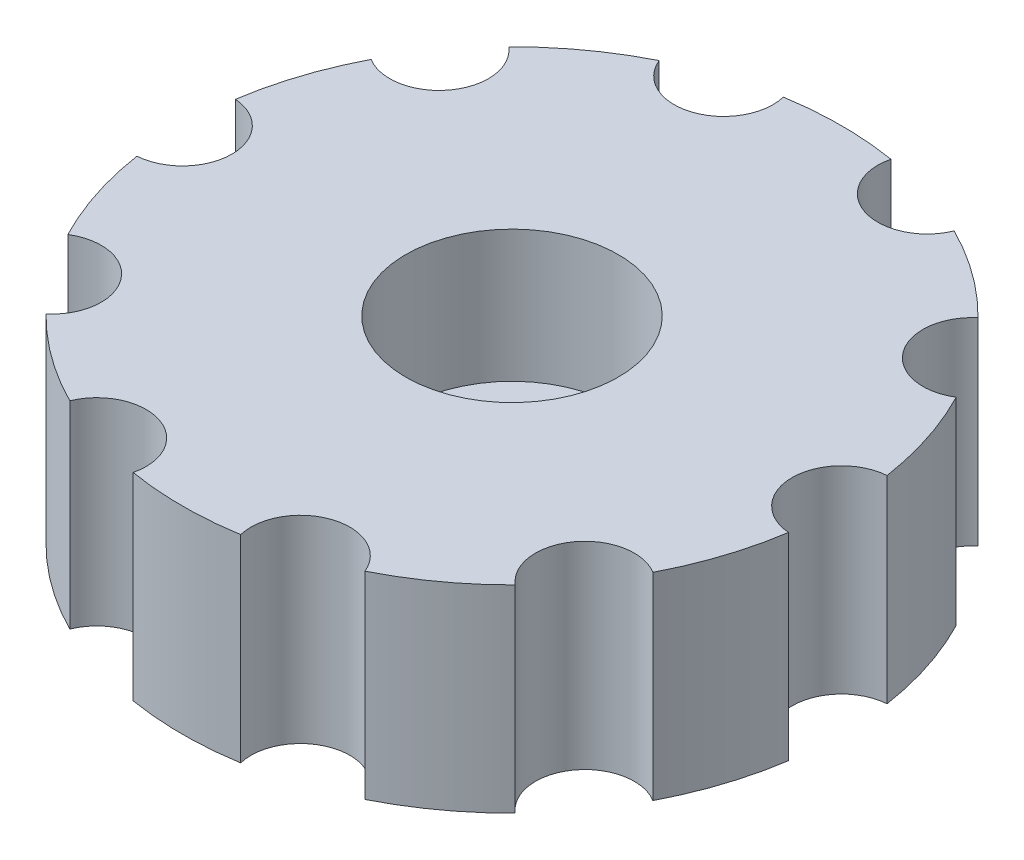
ISO-10303-21;
HEADER;
FILE_DESCRIPTION(('STEP AP214'),'2;1');
FILE_NAME('part.step','',(''),(''),'','','');
FILE_SCHEMA(('AUTOMOTIVE_DESIGN { 1 0 10303 214 1 1 1 1 }'));
ENDSEC;
DATA;
#1=APPLICATION_CONTEXT('core data for automotive mechanical design processes');
#2=APPLICATION_PROTOCOL_DEFINITION('international standard','automotive_design',2000,#1);
#3=PRODUCT_CONTEXT('',#1,'mechanical');
#4=PRODUCT('Part','Part','',(#3));
#5=PRODUCT_RELATED_PRODUCT_CATEGORY('part','',(#4));
#6=PRODUCT_DEFINITION_FORMATION('','',#4);
#7=PRODUCT_DEFINITION_CONTEXT('part definition',#1,'design');
#8=PRODUCT_DEFINITION('design','',#6,#7);
#9=PRODUCT_DEFINITION_SHAPE('','',#8);
#10=(LENGTH_UNIT() NAMED_UNIT(*) SI_UNIT(.MILLI.,.METRE.));
#11=(NAMED_UNIT(*) PLANE_ANGLE_UNIT() SI_UNIT($,.RADIAN.));
#12=(NAMED_UNIT(*) SI_UNIT($,.STERADIAN.) SOLID_ANGLE_UNIT());
#13=UNCERTAINTY_MEASURE_WITH_UNIT(LENGTH_MEASURE(1.E-05),#10,'distance_accuracy_value','');
#14=(GEOMETRIC_REPRESENTATION_CONTEXT(3) GLOBAL_UNCERTAINTY_ASSIGNED_CONTEXT((#13)) GLOBAL_UNIT_ASSIGNED_CONTEXT((#10,
#11,#12)) REPRESENTATION_CONTEXT('',''));
#15=CARTESIAN_POINT('',(0.,0.,0.));
#16=DIRECTION('',(0.,0.,1.));
#17=DIRECTION('',(1.,0.,0.));
#18=AXIS2_PLACEMENT_3D('',#15,#16,#17);
#19=CARTESIAN_POINT('',(0.,12.,0.));
#20=DIRECTION('',(0.,-1.,0.));
#21=DIRECTION('',(0.,0.,-1.));
#22=AXIS2_PLACEMENT_3D('',#19,#20,#21);
#23=CYLINDRICAL_SURFACE('',#22,20.);
#24=CARTESIAN_POINT('',(0.,0.,0.));
#25=DIRECTION('',(0.,1.,0.));
#26=DIRECTION('',(0.,0.,1.));
#27=AXIS2_PLACEMENT_3D('',#24,#25,#26);
#28=CIRCLE('',#27,20.);
#29=CARTESIAN_POINT('',(8.95594475693584,0.,17.8827026344094));
#30=VERTEX_POINT('',#29);
#31=CARTESIAN_POINT('',(14.2399217388475,0.,14.043668640049));
#32=VERTEX_POINT('',#31);
#33=EDGE_CURVE('E315',#30,#32,#28,.T.);
#34=ORIENTED_EDGE('',*,*,#33,.T.);
#35=DIRECTION('',(0.,1.,0.));
#36=VECTOR('',#35,1.);
#37=CARTESIAN_POINT('',(14.2399217388475,6.,14.043668640049));
#38=LINE('',#37,#36);
#39=CARTESIAN_POINT('',(14.2399217388475,12.,14.043668640049));
#40=VERTEX_POINT('',#39);
#41=EDGE_CURVE('E11',#32,#40,#38,.T.);
#42=ORIENTED_EDGE('',*,*,#41,.T.);
#43=CARTESIAN_POINT('',(0.,12.,0.));
#44=DIRECTION('',(0.,1.,0.));
#45=DIRECTION('',(0.,0.,1.));
#46=AXIS2_PLACEMENT_3D('',#43,#44,#45);
#47=CIRCLE('',#46,20.);
#48=CARTESIAN_POINT('',(8.95594475693584,12.,17.8827026344094));
#49=VERTEX_POINT('',#48);
#50=EDGE_CURVE('E436',#49,#40,#47,.T.);
#51=ORIENTED_EDGE('',*,*,#50,.F.);
#52=DIRECTION('',(0.,1.,0.));
#53=VECTOR('',#52,1.);
#54=CARTESIAN_POINT('',(8.95594475693584,6.,17.8827026344094));
#55=LINE('',#54,#53);
#56=EDGE_CURVE('E295',#49,#30,#55,.F.);
#57=ORIENTED_EDGE('',*,*,#56,.T.);
#58=EDGE_LOOP('',(#34,#42,#51,#57));
#59=FACE_BOUND('',#58,.T.);
#60=ADVANCED_FACE('F44',(#59),#23,.T.);
#61=CARTESIAN_POINT('',(-3.26567737059334,0.,19.7315825850638));
#62=VERTEX_POINT('',#61);
#63=CARTESIAN_POINT('',(3.26567737059376,0.,19.7315825850638));
#64=VERTEX_POINT('',#63);
#65=EDGE_CURVE('E312',#62,#64,#28,.T.);
#66=ORIENTED_EDGE('',*,*,#65,.T.);
#67=DIRECTION('',(0.,1.,0.));
#68=VECTOR('',#67,1.);
#69=CARTESIAN_POINT('',(3.26567737059376,6.,19.7315825850638));
#70=LINE('',#69,#68);
#71=CARTESIAN_POINT('',(3.26567737059376,12.,19.7315825850638));
#72=VERTEX_POINT('',#71);
#73=EDGE_CURVE('E293',#64,#72,#70,.T.);
#74=ORIENTED_EDGE('',*,*,#73,.T.);
#75=CARTESIAN_POINT('',(-3.26567737059334,12.,19.7315825850638));
#76=VERTEX_POINT('',#75);
#77=EDGE_CURVE('E439',#76,#72,#47,.T.);
#78=ORIENTED_EDGE('',*,*,#77,.F.);
#79=DIRECTION('',(0.,1.,0.));
#80=VECTOR('',#79,1.);
#81=CARTESIAN_POINT('',(-3.26567737059334,6.,19.7315825850638));
#82=LINE('',#81,#80);
#83=EDGE_CURVE('E283',#76,#62,#82,.F.);
#84=ORIENTED_EDGE('',*,*,#83,.T.);
#85=EDGE_LOOP('',(#66,#74,#78,#84));
#86=FACE_BOUND('',#85,.T.);
#87=ADVANCED_FACE('F429',(#86),#23,.T.);
#88=CARTESIAN_POINT('',(-14.2399217388472,0.,14.0436686400494));
#89=VERTEX_POINT('',#88);
#90=CARTESIAN_POINT('',(-8.95594475693547,0.,17.8827026344096));
#91=VERTEX_POINT('',#90);
#92=EDGE_CURVE('E420',#89,#91,#28,.T.);
#93=ORIENTED_EDGE('',*,*,#92,.T.);
#94=DIRECTION('',(0.,1.,0.));
#95=VECTOR('',#94,1.);
#96=CARTESIAN_POINT('',(-8.95594475693546,6.,17.8827026344096));
#97=LINE('',#96,#95);
#98=CARTESIAN_POINT('',(-8.95594475693547,12.,17.8827026344096));
#99=VERTEX_POINT('',#98);
#100=EDGE_CURVE('E289',#91,#99,#97,.T.);
#101=ORIENTED_EDGE('',*,*,#100,.T.);
#102=CARTESIAN_POINT('',(-14.2399217388472,12.,14.0436686400494));
#103=VERTEX_POINT('',#102);
#104=EDGE_CURVE('E444',#103,#99,#47,.T.);
#105=ORIENTED_EDGE('',*,*,#104,.F.);
#106=DIRECTION('',(0.,1.,0.));
#107=VECTOR('',#106,1.);
#108=CARTESIAN_POINT('',(-14.2399217388472,6.,14.0436686400494));
#109=LINE('',#108,#107);
#110=EDGE_CURVE('E277',#103,#89,#109,.F.);
#111=ORIENTED_EDGE('',*,*,#110,.T.);
#112=EDGE_LOOP('',(#93,#101,#105,#111));
#113=FACE_BOUND('',#112,.T.);
#114=ADVANCED_FACE('F461',(#113),#23,.T.);
#115=CARTESIAN_POINT('',(-19.775,0.,2.99155060127687));
#116=VERTEX_POINT('',#115);
#117=CARTESIAN_POINT('',(-17.7567003886817,0.,9.20323808811823));
#118=VERTEX_POINT('',#117);
#119=EDGE_CURVE('E411',#116,#118,#28,.T.);
#120=ORIENTED_EDGE('',*,*,#119,.T.);
#121=DIRECTION('',(0.,1.,0.));
#122=VECTOR('',#121,1.);
#123=CARTESIAN_POINT('',(-17.7567003886817,6.,9.20323808811823));
#124=LINE('',#123,#122);
#125=CARTESIAN_POINT('',(-17.7567003886817,12.,9.20323808811823));
#126=VERTEX_POINT('',#125);
#127=EDGE_CURVE('E278',#118,#126,#124,.T.);
#128=ORIENTED_EDGE('',*,*,#127,.T.);
#129=CARTESIAN_POINT('',(-19.775,12.,2.99155060127687));
#130=VERTEX_POINT('',#129);
#131=EDGE_CURVE('E449',#130,#126,#47,.T.);
#132=ORIENTED_EDGE('',*,*,#131,.F.);
#133=DIRECTION('',(0.,1.,0.));
#134=VECTOR('',#133,1.);
#135=CARTESIAN_POINT('',(-19.775,6.,2.99155060127687));
#136=LINE('',#135,#134);
#137=EDGE_CURVE('E268',#130,#116,#136,.F.);
#138=ORIENTED_EDGE('',*,*,#137,.T.);
#139=EDGE_LOOP('',(#120,#128,#132,#138));
#140=FACE_BOUND('',#139,.T.);
#141=ADVANCED_FACE('F467',(#140),#23,.T.);
#142=CARTESIAN_POINT('',(-17.7567003886819,0.,-9.20323808811797));
#143=VERTEX_POINT('',#142);
#144=CARTESIAN_POINT('',(-19.775,0.,-2.99155060127687));
#145=VERTEX_POINT('',#144);
#146=EDGE_CURVE('E408',#143,#145,#28,.T.);
#147=ORIENTED_EDGE('',*,*,#146,.T.);
#148=DIRECTION('',(0.,1.,0.));
#149=VECTOR('',#148,1.);
#150=CARTESIAN_POINT('',(-19.775,6.,-2.99155060127687));
#151=LINE('',#150,#149);
#152=CARTESIAN_POINT('',(-19.775,12.,-2.99155060127687));
#153=VERTEX_POINT('',#152);
#154=EDGE_CURVE('E275',#145,#153,#151,.T.);
#155=ORIENTED_EDGE('',*,*,#154,.T.);
#156=CARTESIAN_POINT('',(-17.7567003886819,12.,-9.20323808811797));
#157=VERTEX_POINT('',#156);
#158=EDGE_CURVE('E654',#157,#153,#47,.T.);
#159=ORIENTED_EDGE('',*,*,#158,.F.);
#160=DIRECTION('',(0.,1.,0.));
#161=VECTOR('',#160,1.);
#162=CARTESIAN_POINT('',(-17.7567003886819,6.,-9.20323808811797));
#163=LINE('',#162,#161);
#164=EDGE_CURVE('E257',#157,#143,#163,.F.);
#165=ORIENTED_EDGE('',*,*,#164,.T.);
#166=EDGE_LOOP('',(#147,#155,#159,#165));
#167=FACE_BOUND('',#166,.T.);
#168=ADVANCED_FACE('F468',(#167),#23,.T.);
#169=CARTESIAN_POINT('',(-8.95594475693571,0.,-17.8827026344095));
#170=VERTEX_POINT('',#169);
#171=CARTESIAN_POINT('',(-14.2399217388474,0.,-14.0436686400492));
#172=VERTEX_POINT('',#171);
#173=EDGE_CURVE('E403',#170,#172,#28,.T.);
#174=ORIENTED_EDGE('',*,*,#173,.T.);
#175=DIRECTION('',(0.,1.,0.));
#176=VECTOR('',#175,1.);
#177=CARTESIAN_POINT('',(-14.2399217388474,6.,-14.0436686400492));
#178=LINE('',#177,#176);
#179=CARTESIAN_POINT('',(-14.2399217388474,12.,-14.0436686400492));
#180=VERTEX_POINT('',#179);
#181=EDGE_CURVE('E262',#172,#180,#178,.T.);
#182=ORIENTED_EDGE('',*,*,#181,.T.);
#183=CARTESIAN_POINT('',(-8.95594475693571,12.,-17.8827026344095));
#184=VERTEX_POINT('',#183);
#185=EDGE_CURVE('E225',#184,#180,#47,.T.);
#186=ORIENTED_EDGE('',*,*,#185,.F.);
#187=DIRECTION('',(0.,1.,0.));
#188=VECTOR('',#187,1.);
#189=CARTESIAN_POINT('',(-8.95594475693572,6.,-17.8827026344095));
#190=LINE('',#189,#188);
#191=EDGE_CURVE('E252',#184,#170,#190,.F.);
#192=ORIENTED_EDGE('',*,*,#191,.T.);
#193=EDGE_LOOP('',(#174,#182,#186,#192));
#194=FACE_BOUND('',#193,.T.);
#195=ADVANCED_FACE('F475',(#194),#23,.T.);
#196=CARTESIAN_POINT('',(3.26567737059348,0.,-19.7315825850638));
#197=VERTEX_POINT('',#196);
#198=CARTESIAN_POINT('',(-3.26567737059362,0.,-19.7315825850638));
#199=VERTEX_POINT('',#198);
#200=EDGE_CURVE('E402',#197,#199,#28,.T.);
#201=ORIENTED_EDGE('',*,*,#200,.T.);
#202=DIRECTION('',(0.,1.,0.));
#203=VECTOR('',#202,1.);
#204=CARTESIAN_POINT('',(-3.26567737059362,6.,-19.7315825850638));
#205=LINE('',#204,#203);
#206=CARTESIAN_POINT('',(-3.26567737059362,12.,-19.7315825850638));
#207=VERTEX_POINT('',#206);
#208=EDGE_CURVE('E258',#199,#207,#205,.T.);
#209=ORIENTED_EDGE('',*,*,#208,.T.);
#210=CARTESIAN_POINT('',(3.26567737059348,12.,-19.7315825850638));
#211=VERTEX_POINT('',#210);
#212=EDGE_CURVE('E214',#211,#207,#47,.T.);
#213=ORIENTED_EDGE('',*,*,#212,.F.);
#214=DIRECTION('',(0.,1.,0.));
#215=VECTOR('',#214,1.);
#216=CARTESIAN_POINT('',(3.26567737059348,6.,-19.7315825850638));
#217=LINE('',#216,#215);
#218=EDGE_CURVE('E247',#211,#197,#217,.F.);
#219=ORIENTED_EDGE('',*,*,#218,.T.);
#220=EDGE_LOOP('',(#201,#209,#213,#219));
#221=FACE_BOUND('',#220,.T.);
#222=ADVANCED_FACE('F453',(#221),#23,.T.);
#223=CARTESIAN_POINT('',(14.2399217388473,0.,-14.0436686400493));
#224=VERTEX_POINT('',#223);
#225=CARTESIAN_POINT('',(8.95594475693559,0.,-17.8827026344095));
#226=VERTEX_POINT('',#225);
#227=EDGE_CURVE('E232',#224,#226,#28,.T.);
#228=ORIENTED_EDGE('',*,*,#227,.T.);
#229=DIRECTION('',(0.,1.,0.));
#230=VECTOR('',#229,1.);
#231=CARTESIAN_POINT('',(8.95594475693558,6.,-17.8827026344095));
#232=LINE('',#231,#230);
#233=CARTESIAN_POINT('',(8.95594475693559,12.,-17.8827026344095));
#234=VERTEX_POINT('',#233);
#235=EDGE_CURVE('E213',#226,#234,#232,.T.);
#236=ORIENTED_EDGE('',*,*,#235,.T.);
#237=CARTESIAN_POINT('',(14.2399217388473,12.,-14.0436686400493));
#238=VERTEX_POINT('',#237);
#239=EDGE_CURVE('E204',#238,#234,#47,.T.);
#240=ORIENTED_EDGE('',*,*,#239,.F.);
#241=DIRECTION('',(0.,1.,0.));
#242=VECTOR('',#241,1.);
#243=CARTESIAN_POINT('',(14.2399217388473,6.,-14.0436686400493));
#244=LINE('',#243,#242);
#245=EDGE_CURVE('E185',#238,#224,#244,.F.);
#246=ORIENTED_EDGE('',*,*,#245,.T.);
#247=EDGE_LOOP('',(#228,#236,#240,#246));
#248=FACE_BOUND('',#247,.T.);
#249=ADVANCED_FACE('F215',(#248),#23,.T.);
#250=CARTESIAN_POINT('',(19.775,0.,-2.99155060127687));
#251=VERTEX_POINT('',#250);
#252=CARTESIAN_POINT('',(17.7567003886818,0.,-9.2032380881181));
#253=VERTEX_POINT('',#252);
#254=EDGE_CURVE('E226',#251,#253,#28,.T.);
#255=ORIENTED_EDGE('',*,*,#254,.T.);
#256=DIRECTION('',(0.,1.,0.));
#257=VECTOR('',#256,1.);
#258=CARTESIAN_POINT('',(17.7567003886818,6.,-9.2032380881181));
#259=LINE('',#258,#257);
#260=CARTESIAN_POINT('',(17.7567003886818,12.,-9.2032380881181));
#261=VERTEX_POINT('',#260);
#262=EDGE_CURVE('E191',#253,#261,#259,.T.);
#263=ORIENTED_EDGE('',*,*,#262,.T.);
#264=CARTESIAN_POINT('',(19.775,12.,-2.99155060127687));
#265=VERTEX_POINT('',#264);
#266=EDGE_CURVE('E210',#265,#261,#47,.T.);
#267=ORIENTED_EDGE('',*,*,#266,.F.);
#268=DIRECTION('',(0.,1.,0.));
#269=VECTOR('',#268,1.);
#270=CARTESIAN_POINT('',(19.775,6.,-2.99155060127687));
#271=LINE('',#270,#269);
#272=EDGE_CURVE('E218',#265,#251,#271,.F.);
#273=ORIENTED_EDGE('',*,*,#272,.T.);
#274=EDGE_LOOP('',(#255,#263,#267,#273));
#275=FACE_BOUND('',#274,.T.);
#276=ADVANCED_FACE('F325',(#275),#23,.T.);
#277=CARTESIAN_POINT('',(0.,12.,0.));
#278=DIRECTION('',(0.,-1.,0.));
#279=DIRECTION('',(0.,0.,-1.));
#280=AXIS2_PLACEMENT_3D('',#277,#278,#279);
#281=CYLINDRICAL_SURFACE('',#280,3.25);
#282=CARTESIAN_POINT('',(0.,0.,0.));
#283=DIRECTION('',(0.,1.,0.));
#284=DIRECTION('',(0.,0.,1.));
#285=AXIS2_PLACEMENT_3D('',#282,#283,#284);
#286=CIRCLE('',#285,3.25);
#287=CARTESIAN_POINT('',(0.,0.,3.25));
#288=VERTEX_POINT('',#287);
#289=EDGE_CURVE('E223',#288,#288,#286,.T.);
#290=ORIENTED_EDGE('',*,*,#289,.F.);
#291=EDGE_LOOP('',(#290));
#292=FACE_BOUND('',#291,.T.);
#293=CARTESIAN_POINT('',(0.,4.,0.));
#294=DIRECTION('',(0.,1.,0.));
#295=DIRECTION('',(0.,0.,1.));
#296=AXIS2_PLACEMENT_3D('',#293,#294,#295);
#297=CIRCLE('',#296,3.25);
#298=CARTESIAN_POINT('',(0.,4.,3.25));
#299=VERTEX_POINT('',#298);
#300=EDGE_CURVE('E234',#299,#299,#297,.T.);
#301=ORIENTED_EDGE('',*,*,#300,.T.);
#302=EDGE_LOOP('',(#301));
#303=FACE_BOUND('',#302,.T.);
#304=ADVANCED_FACE('F317',(#292,#303),#281,.F.);
#305=CARTESIAN_POINT('',(0.,12.,0.));
#306=DIRECTION('',(0.,1.,0.));
#307=DIRECTION('',(0.,0.,1.));
#308=AXIS2_PLACEMENT_3D('',#305,#306,#307);
#309=PLANE('',#308);
#310=CARTESIAN_POINT('',(16.1803398874991,12.,11.7557050458492));
#311=DIRECTION('',(0.,1.,0.));
#312=DIRECTION('',(-0.587785252292462,0.,0.809016994374955));
#313=AXIS2_PLACEMENT_3D('',#310,#311,#312);
#314=CIRCLE('',#313,3.);
#315=CARTESIAN_POINT('',(17.7567003886819,12.,9.20323808811784));
#316=VERTEX_POINT('',#315);
#317=EDGE_CURVE('E349',#316,#40,#314,.T.);
#318=ORIENTED_EDGE('',*,*,#317,.F.);
#319=CARTESIAN_POINT('',(19.775,12.,2.99155060127687));
#320=VERTEX_POINT('',#319);
#321=EDGE_CURVE('E219',#316,#320,#47,.T.);
#322=ORIENTED_EDGE('',*,*,#321,.T.);
#323=CARTESIAN_POINT('',(20.,12.,0.));
#324=DIRECTION('',(0.,1.,0.));
#325=DIRECTION('',(0.,0.,1.));
#326=AXIS2_PLACEMENT_3D('',#323,#324,#325);
#327=CIRCLE('',#326,3.);
#328=EDGE_CURVE('E342',#265,#320,#327,.T.);
#329=ORIENTED_EDGE('',*,*,#328,.F.);
#330=ORIENTED_EDGE('',*,*,#266,.T.);
#331=CARTESIAN_POINT('',(16.1803398874989,12.,-11.7557050458495));
#332=DIRECTION('',(0.,1.,0.));
#333=DIRECTION('',(0.587785252292474,0.,0.809016994374947));
#334=AXIS2_PLACEMENT_3D('',#331,#332,#333);
#335=CIRCLE('',#334,3.);
#336=EDGE_CURVE('E183',#238,#261,#335,.T.);
#337=ORIENTED_EDGE('',*,*,#336,.F.);
#338=ORIENTED_EDGE('',*,*,#239,.T.);
#339=CARTESIAN_POINT('',(6.18033988749889,12.,-19.0211303259031));
#340=DIRECTION('',(0.,1.,0.));
#341=DIRECTION('',(0.951056516295155,0.,0.309016994374945));
#342=AXIS2_PLACEMENT_3D('',#339,#340,#341);
#343=CIRCLE('',#342,3.);
#344=EDGE_CURVE('E393',#211,#234,#343,.T.);
#345=ORIENTED_EDGE('',*,*,#344,.F.);
#346=ORIENTED_EDGE('',*,*,#212,.T.);
#347=CARTESIAN_POINT('',(-6.18033988749903,12.,-19.021130325903));
#348=DIRECTION('',(0.,1.,0.));
#349=DIRECTION('',(0.951056516295152,0.,-0.309016994374952));
#350=AXIS2_PLACEMENT_3D('',#347,#348,#349);
#351=CIRCLE('',#350,3.);
#352=EDGE_CURVE('E390',#184,#207,#351,.T.);
#353=ORIENTED_EDGE('',*,*,#352,.F.);
#354=ORIENTED_EDGE('',*,*,#185,.T.);
#355=CARTESIAN_POINT('',(-16.180339887499,12.,-11.7557050458494));
#356=DIRECTION('',(0.,1.,0.));
#357=DIRECTION('',(0.587785252292469,0.,-0.809016994374951));
#358=AXIS2_PLACEMENT_3D('',#355,#356,#357);
#359=CIRCLE('',#358,3.);
#360=EDGE_CURVE('E379',#157,#180,#359,.T.);
#361=ORIENTED_EDGE('',*,*,#360,.F.);
#362=ORIENTED_EDGE('',*,*,#158,.T.);
#363=CARTESIAN_POINT('',(-20.,12.,0.));
#364=DIRECTION('',(0.,1.,0.));
#365=DIRECTION('',(0.,0.,-1.));
#366=AXIS2_PLACEMENT_3D('',#363,#364,#365);
#367=CIRCLE('',#366,3.);
#368=EDGE_CURVE('E373',#130,#153,#367,.T.);
#369=ORIENTED_EDGE('',*,*,#368,.F.);
#370=ORIENTED_EDGE('',*,*,#131,.T.);
#371=CARTESIAN_POINT('',(-16.1803398874988,12.,11.7557050458496));
#372=DIRECTION('',(0.,1.,0.));
#373=DIRECTION('',(-0.58778525229248,0.,-0.809016994374942));
#374=AXIS2_PLACEMENT_3D('',#371,#372,#373);
#375=CIRCLE('',#374,3.);
#376=EDGE_CURVE('E368',#103,#126,#375,.T.);
#377=ORIENTED_EDGE('',*,*,#376,.F.);
#378=ORIENTED_EDGE('',*,*,#104,.T.);
#379=CARTESIAN_POINT('',(-6.18033988749876,12.,19.0211303259031));
#380=DIRECTION('',(0.,1.,0.));
#381=DIRECTION('',(-0.951056516295157,0.,-0.309016994374938));
#382=AXIS2_PLACEMENT_3D('',#379,#380,#381);
#383=CIRCLE('',#382,3.);
#384=EDGE_CURVE('E356',#76,#99,#383,.T.);
#385=ORIENTED_EDGE('',*,*,#384,.F.);
#386=ORIENTED_EDGE('',*,*,#77,.T.);
#387=CARTESIAN_POINT('',(6.18033988749916,12.,19.021130325903));
#388=DIRECTION('',(0.,1.,0.));
#389=DIRECTION('',(-0.95105651629515,0.,0.309016994374958));
#390=AXIS2_PLACEMENT_3D('',#387,#388,#389);
#391=CIRCLE('',#390,3.);
#392=EDGE_CURVE('E353',#49,#72,#391,.T.);
#393=ORIENTED_EDGE('',*,*,#392,.F.);
#394=ORIENTED_EDGE('',*,*,#50,.T.);
#395=EDGE_LOOP('',(#318,#322,#329,#330,#337,#338,#345,#346,#353,#354,#361,#362,#369,#370,#377,
#378,#385,#386,#393,#394));
#396=FACE_BOUND('',#395,.T.);
#397=CARTESIAN_POINT('',(0.,12.,0.));
#398=DIRECTION('',(0.,1.,0.));
#399=DIRECTION('',(0.,0.,1.));
#400=AXIS2_PLACEMENT_3D('',#397,#398,#399);
#401=CIRCLE('',#400,6.45);
#402=CARTESIAN_POINT('',(0.,12.,6.45));
#403=VERTEX_POINT('',#402);
#404=EDGE_CURVE('E339',#403,#403,#401,.T.);
#405=ORIENTED_EDGE('',*,*,#404,.F.);
#406=EDGE_LOOP('',(#405));
#407=FACE_BOUND('',#406,.T.);
#408=ADVANCED_FACE('F203',(#396,#407),#309,.T.);
#409=CARTESIAN_POINT('',(0.,0.,0.));
#410=DIRECTION('',(0.,1.,0.));
#411=DIRECTION('',(0.,0.,1.));
#412=AXIS2_PLACEMENT_3D('',#409,#410,#411);
#413=PLANE('',#412);
#414=CARTESIAN_POINT('',(17.7567003886819,0.,9.20323808811784));
#415=VERTEX_POINT('',#414);
#416=CARTESIAN_POINT('',(19.775,0.,2.99155060127687));
#417=VERTEX_POINT('',#416);
#418=EDGE_CURVE('E235',#415,#417,#28,.T.);
#419=ORIENTED_EDGE('',*,*,#418,.F.);
#420=CARTESIAN_POINT('',(16.1803398874991,0.,11.7557050458492));
#421=DIRECTION('',(0.,1.,0.));
#422=DIRECTION('',(-0.587785252292462,0.,0.809016994374955));
#423=AXIS2_PLACEMENT_3D('',#420,#421,#422);
#424=CIRCLE('',#423,3.);
#425=EDGE_CURVE('E64',#415,#32,#424,.T.);
#426=ORIENTED_EDGE('',*,*,#425,.T.);
#427=ORIENTED_EDGE('',*,*,#33,.F.);
#428=CARTESIAN_POINT('',(6.18033988749916,0.,19.021130325903));
#429=DIRECTION('',(0.,1.,0.));
#430=DIRECTION('',(-0.95105651629515,0.,0.309016994374958));
#431=AXIS2_PLACEMENT_3D('',#428,#429,#430);
#432=CIRCLE('',#431,3.);
#433=EDGE_CURVE('E66',#30,#64,#432,.T.);
#434=ORIENTED_EDGE('',*,*,#433,.T.);
#435=ORIENTED_EDGE('',*,*,#65,.F.);
#436=CARTESIAN_POINT('',(-6.18033988749876,0.,19.0211303259031));
#437=DIRECTION('',(0.,1.,0.));
#438=DIRECTION('',(-0.951056516295157,0.,-0.309016994374938));
#439=AXIS2_PLACEMENT_3D('',#436,#437,#438);
#440=CIRCLE('',#439,3.);
#441=EDGE_CURVE('E362',#62,#91,#440,.T.);
#442=ORIENTED_EDGE('',*,*,#441,.T.);
#443=ORIENTED_EDGE('',*,*,#92,.F.);
#444=CARTESIAN_POINT('',(-16.1803398874988,0.,11.7557050458496));
#445=DIRECTION('',(0.,1.,0.));
#446=DIRECTION('',(-0.58778525229248,0.,-0.809016994374942));
#447=AXIS2_PLACEMENT_3D('',#444,#445,#446);
#448=CIRCLE('',#447,3.);
#449=EDGE_CURVE('E369',#89,#118,#448,.T.);
#450=ORIENTED_EDGE('',*,*,#449,.T.);
#451=ORIENTED_EDGE('',*,*,#119,.F.);
#452=CARTESIAN_POINT('',(-20.,0.,0.));
#453=DIRECTION('',(0.,1.,0.));
#454=DIRECTION('',(0.,0.,-1.));
#455=AXIS2_PLACEMENT_3D('',#452,#453,#454);
#456=CIRCLE('',#455,3.);
#457=EDGE_CURVE('E376',#116,#145,#456,.T.);
#458=ORIENTED_EDGE('',*,*,#457,.T.);
#459=ORIENTED_EDGE('',*,*,#146,.F.);
#460=CARTESIAN_POINT('',(-16.180339887499,0.,-11.7557050458494));
#461=DIRECTION('',(0.,1.,0.));
#462=DIRECTION('',(0.587785252292469,0.,-0.809016994374951));
#463=AXIS2_PLACEMENT_3D('',#460,#461,#462);
#464=CIRCLE('',#463,3.);
#465=EDGE_CURVE('E382',#143,#172,#464,.T.);
#466=ORIENTED_EDGE('',*,*,#465,.T.);
#467=ORIENTED_EDGE('',*,*,#173,.F.);
#468=CARTESIAN_POINT('',(-6.18033988749903,0.,-19.021130325903));
#469=DIRECTION('',(0.,1.,0.));
#470=DIRECTION('',(0.951056516295152,0.,-0.309016994374952));
#471=AXIS2_PLACEMENT_3D('',#468,#469,#470);
#472=CIRCLE('',#471,3.);
#473=EDGE_CURVE('E388',#170,#199,#472,.T.);
#474=ORIENTED_EDGE('',*,*,#473,.T.);
#475=ORIENTED_EDGE('',*,*,#200,.F.);
#476=CARTESIAN_POINT('',(6.18033988749889,0.,-19.0211303259031));
#477=DIRECTION('',(0.,1.,0.));
#478=DIRECTION('',(0.951056516295155,0.,0.309016994374945));
#479=AXIS2_PLACEMENT_3D('',#476,#477,#478);
#480=CIRCLE('',#479,3.);
#481=EDGE_CURVE('E207',#197,#226,#480,.T.);
#482=ORIENTED_EDGE('',*,*,#481,.T.);
#483=ORIENTED_EDGE('',*,*,#227,.F.);
#484=CARTESIAN_POINT('',(16.1803398874989,0.,-11.7557050458495));
#485=DIRECTION('',(0.,1.,0.));
#486=DIRECTION('',(0.587785252292474,0.,0.809016994374947));
#487=AXIS2_PLACEMENT_3D('',#484,#485,#486);
#488=CIRCLE('',#487,3.);
#489=EDGE_CURVE('E190',#224,#253,#488,.T.);
#490=ORIENTED_EDGE('',*,*,#489,.T.);
#491=ORIENTED_EDGE('',*,*,#254,.F.);
#492=CARTESIAN_POINT('',(20.,0.,0.));
#493=DIRECTION('',(0.,1.,0.));
#494=DIRECTION('',(0.,0.,1.));
#495=AXIS2_PLACEMENT_3D('',#492,#493,#494);
#496=CIRCLE('',#495,3.);
#497=EDGE_CURVE('E309',#251,#417,#496,.T.);
#498=ORIENTED_EDGE('',*,*,#497,.T.);
#499=EDGE_LOOP('',(#419,#426,#427,#434,#435,#442,#443,#450,#451,#458,#459,#466,#467,#474,#475,
#482,#483,#490,#491,#498));
#500=FACE_BOUND('',#499,.T.);
#501=ORIENTED_EDGE('',*,*,#289,.T.);
#502=EDGE_LOOP('',(#501));
#503=FACE_BOUND('',#502,.T.);
#504=ADVANCED_FACE('F303',(#500,#503),#413,.F.);
#505=ORIENTED_EDGE('',*,*,#321,.F.);
#506=DIRECTION('',(0.,1.,0.));
#507=VECTOR('',#506,1.);
#508=CARTESIAN_POINT('',(17.7567003886819,6.,9.20323808811784));
#509=LINE('',#508,#507);
#510=EDGE_CURVE('E53',#316,#415,#509,.F.);
#511=ORIENTED_EDGE('',*,*,#510,.T.);
#512=ORIENTED_EDGE('',*,*,#418,.T.);
#513=DIRECTION('',(0.,1.,0.));
#514=VECTOR('',#513,1.);
#515=CARTESIAN_POINT('',(19.775,6.,2.99155060127687));
#516=LINE('',#515,#514);
#517=EDGE_CURVE('E193',#417,#320,#516,.T.);
#518=ORIENTED_EDGE('',*,*,#517,.T.);
#519=EDGE_LOOP('',(#505,#511,#512,#518));
#520=FACE_BOUND('',#519,.T.);
#521=ADVANCED_FACE('F50',(#520),#23,.T.);
#522=CARTESIAN_POINT('',(0.,4.,0.));
#523=DIRECTION('',(0.,1.,0.));
#524=DIRECTION('',(0.,0.,1.));
#525=AXIS2_PLACEMENT_3D('',#522,#523,#524);
#526=CYLINDRICAL_SURFACE('',#525,6.45);
#527=CARTESIAN_POINT('',(0.,4.,0.));
#528=DIRECTION('',(0.,1.,0.));
#529=DIRECTION('',(0.,0.,1.));
#530=AXIS2_PLACEMENT_3D('',#527,#528,#529);
#531=CIRCLE('',#530,6.45);
#532=CARTESIAN_POINT('',(0.,4.,6.45));
#533=VERTEX_POINT('',#532);
#534=EDGE_CURVE('E240',#533,#533,#531,.T.);
#535=ORIENTED_EDGE('',*,*,#534,.F.);
#536=EDGE_LOOP('',(#535));
#537=FACE_BOUND('',#536,.T.);
#538=ORIENTED_EDGE('',*,*,#404,.T.);
#539=EDGE_LOOP('',(#538));
#540=FACE_BOUND('',#539,.T.);
#541=ADVANCED_FACE('F329',(#537,#540),#526,.F.);
#542=CARTESIAN_POINT('',(0.,4.,0.));
#543=DIRECTION('',(0.,1.,0.));
#544=DIRECTION('',(0.,0.,1.));
#545=AXIS2_PLACEMENT_3D('',#542,#543,#544);
#546=PLANE('',#545);
#547=ORIENTED_EDGE('',*,*,#300,.F.);
#548=EDGE_LOOP('',(#547));
#549=FACE_BOUND('',#548,.T.);
#550=ORIENTED_EDGE('',*,*,#534,.T.);
#551=EDGE_LOOP('',(#550));
#552=FACE_BOUND('',#551,.T.);
#553=ADVANCED_FACE('F326',(#549,#552),#546,.T.);
#554=CARTESIAN_POINT('',(20.,0.,0.));
#555=DIRECTION('',(0.,1.,0.));
#556=DIRECTION('',(0.,0.,1.));
#557=AXIS2_PLACEMENT_3D('',#554,#555,#556);
#558=CYLINDRICAL_SURFACE('',#557,3.);
#559=ORIENTED_EDGE('',*,*,#497,.F.);
#560=ORIENTED_EDGE('',*,*,#272,.F.);
#561=ORIENTED_EDGE('',*,*,#328,.T.);
#562=ORIENTED_EDGE('',*,*,#517,.F.);
#563=EDGE_LOOP('',(#559,#560,#561,#562));
#564=FACE_BOUND('',#563,.T.);
#565=ADVANCED_FACE('F328',(#564),#558,.F.);
#566=CARTESIAN_POINT('',(16.1803398874989,0.,-11.7557050458495));
#567=DIRECTION('',(0.,1.,0.));
#568=DIRECTION('',(0.,0.,1.));
#569=AXIS2_PLACEMENT_3D('',#566,#567,#568);
#570=CYLINDRICAL_SURFACE('',#569,3.);
#571=ORIENTED_EDGE('',*,*,#489,.F.);
#572=ORIENTED_EDGE('',*,*,#245,.F.);
#573=ORIENTED_EDGE('',*,*,#336,.T.);
#574=ORIENTED_EDGE('',*,*,#262,.F.);
#575=EDGE_LOOP('',(#571,#572,#573,#574));
#576=FACE_BOUND('',#575,.T.);
#577=ADVANCED_FACE('F184',(#576),#570,.F.);
#578=CARTESIAN_POINT('',(6.18033988749889,0.,-19.0211303259031));
#579=DIRECTION('',(0.,1.,0.));
#580=DIRECTION('',(0.,0.,1.));
#581=AXIS2_PLACEMENT_3D('',#578,#579,#580);
#582=CYLINDRICAL_SURFACE('',#581,3.);
#583=ORIENTED_EDGE('',*,*,#481,.F.);
#584=ORIENTED_EDGE('',*,*,#218,.F.);
#585=ORIENTED_EDGE('',*,*,#344,.T.);
#586=ORIENTED_EDGE('',*,*,#235,.F.);
#587=EDGE_LOOP('',(#583,#584,#585,#586));
#588=FACE_BOUND('',#587,.T.);
#589=ADVANCED_FACE('F543',(#588),#582,.F.);
#590=CARTESIAN_POINT('',(-6.18033988749903,0.,-19.021130325903));
#591=DIRECTION('',(0.,1.,0.));
#592=DIRECTION('',(0.,0.,1.));
#593=AXIS2_PLACEMENT_3D('',#590,#591,#592);
#594=CYLINDRICAL_SURFACE('',#593,3.);
#595=ORIENTED_EDGE('',*,*,#473,.F.);
#596=ORIENTED_EDGE('',*,*,#191,.F.);
#597=ORIENTED_EDGE('',*,*,#352,.T.);
#598=ORIENTED_EDGE('',*,*,#208,.F.);
#599=EDGE_LOOP('',(#595,#596,#597,#598));
#600=FACE_BOUND('',#599,.T.);
#601=ADVANCED_FACE('F555',(#600),#594,.F.);
#602=CARTESIAN_POINT('',(-16.180339887499,0.,-11.7557050458494));
#603=DIRECTION('',(0.,1.,0.));
#604=DIRECTION('',(0.,0.,1.));
#605=AXIS2_PLACEMENT_3D('',#602,#603,#604);
#606=CYLINDRICAL_SURFACE('',#605,3.);
#607=ORIENTED_EDGE('',*,*,#465,.F.);
#608=ORIENTED_EDGE('',*,*,#164,.F.);
#609=ORIENTED_EDGE('',*,*,#360,.T.);
#610=ORIENTED_EDGE('',*,*,#181,.F.);
#611=EDGE_LOOP('',(#607,#608,#609,#610));
#612=FACE_BOUND('',#611,.T.);
#613=ADVANCED_FACE('F557',(#612),#606,.F.);
#614=CARTESIAN_POINT('',(-20.,0.,0.));
#615=DIRECTION('',(0.,1.,0.));
#616=DIRECTION('',(0.,0.,1.));
#617=AXIS2_PLACEMENT_3D('',#614,#615,#616);
#618=CYLINDRICAL_SURFACE('',#617,3.);
#619=ORIENTED_EDGE('',*,*,#457,.F.);
#620=ORIENTED_EDGE('',*,*,#137,.F.);
#621=ORIENTED_EDGE('',*,*,#368,.T.);
#622=ORIENTED_EDGE('',*,*,#154,.F.);
#623=EDGE_LOOP('',(#619,#620,#621,#622));
#624=FACE_BOUND('',#623,.T.);
#625=ADVANCED_FACE('F569',(#624),#618,.F.);
#626=CARTESIAN_POINT('',(-16.1803398874988,0.,11.7557050458496));
#627=DIRECTION('',(0.,1.,0.));
#628=DIRECTION('',(0.,0.,1.));
#629=AXIS2_PLACEMENT_3D('',#626,#627,#628);
#630=CYLINDRICAL_SURFACE('',#629,3.);
#631=ORIENTED_EDGE('',*,*,#449,.F.);
#632=ORIENTED_EDGE('',*,*,#110,.F.);
#633=ORIENTED_EDGE('',*,*,#376,.T.);
#634=ORIENTED_EDGE('',*,*,#127,.F.);
#635=EDGE_LOOP('',(#631,#632,#633,#634));
#636=FACE_BOUND('',#635,.T.);
#637=ADVANCED_FACE('F579',(#636),#630,.F.);
#638=CARTESIAN_POINT('',(-6.18033988749876,0.,19.0211303259031));
#639=DIRECTION('',(0.,1.,0.));
#640=DIRECTION('',(0.,0.,1.));
#641=AXIS2_PLACEMENT_3D('',#638,#639,#640);
#642=CYLINDRICAL_SURFACE('',#641,3.);
#643=ORIENTED_EDGE('',*,*,#441,.F.);
#644=ORIENTED_EDGE('',*,*,#83,.F.);
#645=ORIENTED_EDGE('',*,*,#384,.T.);
#646=ORIENTED_EDGE('',*,*,#100,.F.);
#647=EDGE_LOOP('',(#643,#644,#645,#646));
#648=FACE_BOUND('',#647,.T.);
#649=ADVANCED_FACE('F590',(#648),#642,.F.);
#650=CARTESIAN_POINT('',(6.18033988749916,0.,19.021130325903));
#651=DIRECTION('',(0.,1.,0.));
#652=DIRECTION('',(0.,0.,1.));
#653=AXIS2_PLACEMENT_3D('',#650,#651,#652);
#654=CYLINDRICAL_SURFACE('',#653,3.);
#655=ORIENTED_EDGE('',*,*,#433,.F.);
#656=ORIENTED_EDGE('',*,*,#56,.F.);
#657=ORIENTED_EDGE('',*,*,#392,.T.);
#658=ORIENTED_EDGE('',*,*,#73,.F.);
#659=EDGE_LOOP('',(#655,#656,#657,#658));
#660=FACE_BOUND('',#659,.T.);
#661=ADVANCED_FACE('F437',(#660),#654,.F.);
#662=CARTESIAN_POINT('',(16.1803398874991,0.,11.7557050458492));
#663=DIRECTION('',(0.,1.,0.));
#664=DIRECTION('',(0.,0.,1.));
#665=AXIS2_PLACEMENT_3D('',#662,#663,#664);
#666=CYLINDRICAL_SURFACE('',#665,3.);
#667=ORIENTED_EDGE('',*,*,#425,.F.);
#668=ORIENTED_EDGE('',*,*,#510,.F.);
#669=ORIENTED_EDGE('',*,*,#317,.T.);
#670=ORIENTED_EDGE('',*,*,#41,.F.);
#671=EDGE_LOOP('',(#667,#668,#669,#670));
#672=FACE_BOUND('',#671,.T.);
#673=ADVANCED_FACE('F603',(#672),#666,.F.);
#674=CLOSED_SHELL('',(#60,#87,#114,#141,#168,#195,#222,#249,#276,#304,#408,#504,#521,#541,#553,
#565,#577,#589,#601,#613,#625,#637,#649,#661,#673));
#675=MANIFOLD_SOLID_BREP('B2',#674);
#676=ADVANCED_BREP_SHAPE_REPRESENTATION('',(#18,#675),#14);
#677=SHAPE_DEFINITION_REPRESENTATION(#9,#676);
ENDSEC;
END-ISO-10303-21;
